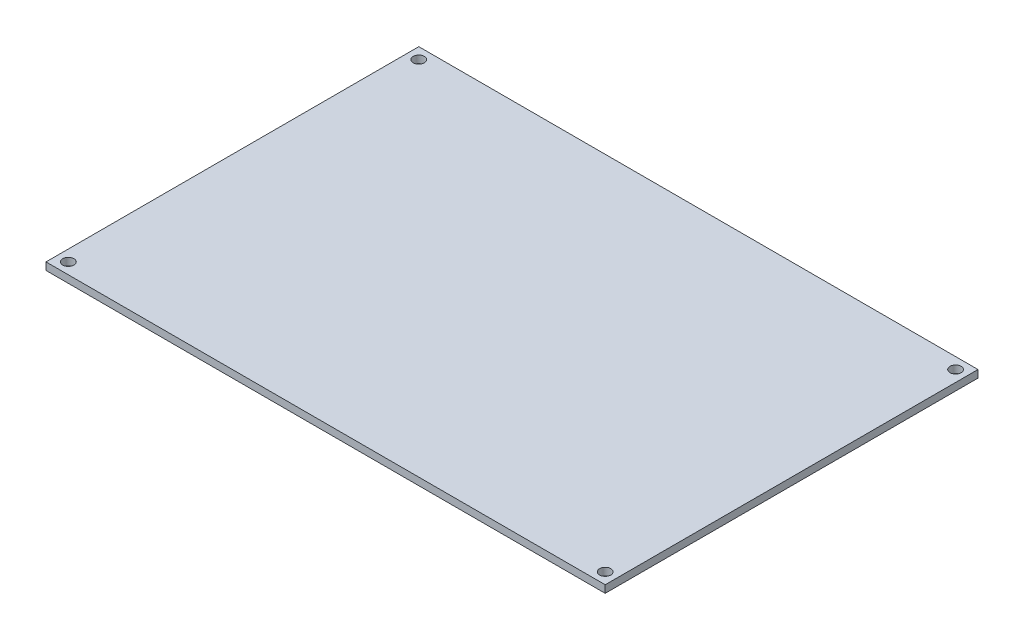
ISO-10303-21;
HEADER;
FILE_DESCRIPTION(('STEP AP214'),'2;1');
FILE_NAME('part.step','',(''),(''),'','','');
FILE_SCHEMA(('AUTOMOTIVE_DESIGN { 1 0 10303 214 1 1 1 1 }'));
ENDSEC;
DATA;
#1=APPLICATION_CONTEXT('core data for automotive mechanical design processes');
#2=APPLICATION_PROTOCOL_DEFINITION('international standard','automotive_design',2000,#1);
#3=PRODUCT_CONTEXT('',#1,'mechanical');
#4=PRODUCT('Part','Part','',(#3));
#5=PRODUCT_RELATED_PRODUCT_CATEGORY('part','',(#4));
#6=PRODUCT_DEFINITION_FORMATION('','',#4);
#7=PRODUCT_DEFINITION_CONTEXT('part definition',#1,'design');
#8=PRODUCT_DEFINITION('design','',#6,#7);
#9=PRODUCT_DEFINITION_SHAPE('','',#8);
#10=(LENGTH_UNIT() NAMED_UNIT(*) SI_UNIT(.MILLI.,.METRE.));
#11=(NAMED_UNIT(*) PLANE_ANGLE_UNIT() SI_UNIT($,.RADIAN.));
#12=(NAMED_UNIT(*) SI_UNIT($,.STERADIAN.) SOLID_ANGLE_UNIT());
#13=UNCERTAINTY_MEASURE_WITH_UNIT(LENGTH_MEASURE(1.E-05),#10,'distance_accuracy_value','');
#14=(GEOMETRIC_REPRESENTATION_CONTEXT(3) GLOBAL_UNCERTAINTY_ASSIGNED_CONTEXT((#13)) GLOBAL_UNIT_ASSIGNED_CONTEXT((#10,
#11,#12)) REPRESENTATION_CONTEXT('',''));
#15=CARTESIAN_POINT('',(0.,0.,0.));
#16=DIRECTION('',(0.,0.,1.));
#17=DIRECTION('',(1.,0.,0.));
#18=AXIS2_PLACEMENT_3D('',#15,#16,#17);
#19=CARTESIAN_POINT('',(75.,2.,-50.));
#20=DIRECTION('',(-1.,0.,0.));
#21=DIRECTION('',(0.,0.,1.));
#22=AXIS2_PLACEMENT_3D('',#19,#20,#21);
#23=PLANE('',#22);
#24=DIRECTION('',(0.,0.,-1.));
#25=VECTOR('',#24,1.);
#26=CARTESIAN_POINT('',(75.,0.,-50.));
#27=LINE('',#26,#25);
#28=CARTESIAN_POINT('',(75.,0.,50.));
#29=VERTEX_POINT('',#28);
#30=CARTESIAN_POINT('',(75.,0.,-50.));
#31=VERTEX_POINT('',#30);
#32=EDGE_CURVE('E107',#29,#31,#27,.T.);
#33=ORIENTED_EDGE('',*,*,#32,.T.);
#34=DIRECTION('',(0.,-1.,0.));
#35=VECTOR('',#34,1.);
#36=CARTESIAN_POINT('',(75.,2.,-50.));
#37=LINE('',#36,#35);
#38=CARTESIAN_POINT('',(75.,2.,-50.));
#39=VERTEX_POINT('',#38);
#40=EDGE_CURVE('E11',#39,#31,#37,.T.);
#41=ORIENTED_EDGE('',*,*,#40,.F.);
#42=DIRECTION('',(0.,0.,-1.));
#43=VECTOR('',#42,1.);
#44=CARTESIAN_POINT('',(75.,2.,-50.));
#45=LINE('',#44,#43);
#46=CARTESIAN_POINT('',(75.,2.,50.));
#47=VERTEX_POINT('',#46);
#48=EDGE_CURVE('E91',#47,#39,#45,.T.);
#49=ORIENTED_EDGE('',*,*,#48,.F.);
#50=DIRECTION('',(0.,-1.,0.));
#51=VECTOR('',#50,1.);
#52=CARTESIAN_POINT('',(75.,2.,50.));
#53=LINE('',#52,#51);
#54=EDGE_CURVE('E103',#47,#29,#53,.T.);
#55=ORIENTED_EDGE('',*,*,#54,.T.);
#56=EDGE_LOOP('',(#33,#41,#49,#55));
#57=FACE_BOUND('',#56,.T.);
#58=ADVANCED_FACE('F39',(#57),#23,.F.);
#59=CARTESIAN_POINT('',(-75.,2.,-50.));
#60=DIRECTION('',(0.,0.,1.));
#61=DIRECTION('',(1.,0.,0.));
#62=AXIS2_PLACEMENT_3D('',#59,#60,#61);
#63=PLANE('',#62);
#64=DIRECTION('',(-1.,0.,0.));
#65=VECTOR('',#64,1.);
#66=CARTESIAN_POINT('',(-75.,0.,-50.));
#67=LINE('',#66,#65);
#68=CARTESIAN_POINT('',(-75.,0.,-50.));
#69=VERTEX_POINT('',#68);
#70=EDGE_CURVE('E96',#31,#69,#67,.T.);
#71=ORIENTED_EDGE('',*,*,#70,.T.);
#72=DIRECTION('',(0.,-1.,0.));
#73=VECTOR('',#72,1.);
#74=CARTESIAN_POINT('',(-75.,2.,-50.));
#75=LINE('',#74,#73);
#76=CARTESIAN_POINT('',(-75.,2.,-50.));
#77=VERTEX_POINT('',#76);
#78=EDGE_CURVE('E48',#77,#69,#75,.T.);
#79=ORIENTED_EDGE('',*,*,#78,.F.);
#80=DIRECTION('',(-1.,0.,0.));
#81=VECTOR('',#80,1.);
#82=CARTESIAN_POINT('',(-75.,2.,-50.));
#83=LINE('',#82,#81);
#84=EDGE_CURVE('E86',#39,#77,#83,.T.);
#85=ORIENTED_EDGE('',*,*,#84,.F.);
#86=ORIENTED_EDGE('',*,*,#40,.T.);
#87=EDGE_LOOP('',(#71,#79,#85,#86));
#88=FACE_BOUND('',#87,.T.);
#89=ADVANCED_FACE('F95',(#88),#63,.F.);
#90=CARTESIAN_POINT('',(-75.,2.,-50.));
#91=DIRECTION('',(1.,0.,0.));
#92=DIRECTION('',(0.,0.,-1.));
#93=AXIS2_PLACEMENT_3D('',#90,#91,#92);
#94=PLANE('',#93);
#95=DIRECTION('',(0.,0.,1.));
#96=VECTOR('',#95,1.);
#97=CARTESIAN_POINT('',(-75.,0.,-50.));
#98=LINE('',#97,#96);
#99=CARTESIAN_POINT('',(-75.,0.,50.));
#100=VERTEX_POINT('',#99);
#101=EDGE_CURVE('E73',#69,#100,#98,.T.);
#102=ORIENTED_EDGE('',*,*,#101,.T.);
#103=DIRECTION('',(0.,-1.,0.));
#104=VECTOR('',#103,1.);
#105=CARTESIAN_POINT('',(-75.,2.,50.));
#106=LINE('',#105,#104);
#107=CARTESIAN_POINT('',(-75.,2.,50.));
#108=VERTEX_POINT('',#107);
#109=EDGE_CURVE('E98',#108,#100,#106,.T.);
#110=ORIENTED_EDGE('',*,*,#109,.F.);
#111=DIRECTION('',(0.,0.,1.));
#112=VECTOR('',#111,1.);
#113=CARTESIAN_POINT('',(-75.,2.,-50.));
#114=LINE('',#113,#112);
#115=EDGE_CURVE('E89',#77,#108,#114,.T.);
#116=ORIENTED_EDGE('',*,*,#115,.F.);
#117=ORIENTED_EDGE('',*,*,#78,.T.);
#118=EDGE_LOOP('',(#102,#110,#116,#117));
#119=FACE_BOUND('',#118,.T.);
#120=ADVANCED_FACE('F99',(#119),#94,.F.);
#121=CARTESIAN_POINT('',(-75.,2.,50.));
#122=DIRECTION('',(0.,0.,-1.));
#123=DIRECTION('',(-1.,0.,0.));
#124=AXIS2_PLACEMENT_3D('',#121,#122,#123);
#125=PLANE('',#124);
#126=DIRECTION('',(1.,0.,0.));
#127=VECTOR('',#126,1.);
#128=CARTESIAN_POINT('',(-75.,0.,50.));
#129=LINE('',#128,#127);
#130=EDGE_CURVE('E79',#100,#29,#129,.T.);
#131=ORIENTED_EDGE('',*,*,#130,.T.);
#132=ORIENTED_EDGE('',*,*,#54,.F.);
#133=DIRECTION('',(1.,0.,0.));
#134=VECTOR('',#133,1.);
#135=CARTESIAN_POINT('',(-75.,2.,50.));
#136=LINE('',#135,#134);
#137=EDGE_CURVE('E56',#108,#47,#136,.T.);
#138=ORIENTED_EDGE('',*,*,#137,.F.);
#139=ORIENTED_EDGE('',*,*,#109,.T.);
#140=EDGE_LOOP('',(#131,#132,#138,#139));
#141=FACE_BOUND('',#140,.T.);
#142=ADVANCED_FACE('F121',(#141),#125,.F.);
#143=CARTESIAN_POINT('',(0.,2.,0.));
#144=DIRECTION('',(0.,1.,0.));
#145=DIRECTION('',(0.,0.,1.));
#146=AXIS2_PLACEMENT_3D('',#143,#144,#145);
#147=PLANE('',#146);
#148=CARTESIAN_POINT('',(72.,2.,-47.));
#149=DIRECTION('',(0.,1.,0.));
#150=DIRECTION('',(0.,0.,1.));
#151=AXIS2_PLACEMENT_3D('',#148,#149,#150);
#152=CIRCLE('',#151,1.5);
#153=CARTESIAN_POINT('',(72.,2.,-45.5));
#154=VERTEX_POINT('',#153);
#155=EDGE_CURVE('E136',#154,#154,#152,.T.);
#156=ORIENTED_EDGE('',*,*,#155,.F.);
#157=EDGE_LOOP('',(#156));
#158=FACE_BOUND('',#157,.T.);
#159=CARTESIAN_POINT('',(72.,2.,47.));
#160=DIRECTION('',(0.,1.,0.));
#161=DIRECTION('',(0.,0.,1.));
#162=AXIS2_PLACEMENT_3D('',#159,#160,#161);
#163=CIRCLE('',#162,1.5);
#164=CARTESIAN_POINT('',(72.,2.,48.5));
#165=VERTEX_POINT('',#164);
#166=EDGE_CURVE('E144',#165,#165,#163,.T.);
#167=ORIENTED_EDGE('',*,*,#166,.F.);
#168=EDGE_LOOP('',(#167));
#169=FACE_BOUND('',#168,.T.);
#170=CARTESIAN_POINT('',(-72.,2.,47.));
#171=DIRECTION('',(0.,1.,0.));
#172=DIRECTION('',(0.,0.,1.));
#173=AXIS2_PLACEMENT_3D('',#170,#171,#172);
#174=CIRCLE('',#173,1.5);
#175=CARTESIAN_POINT('',(-72.,2.,48.5));
#176=VERTEX_POINT('',#175);
#177=EDGE_CURVE('E152',#176,#176,#174,.T.);
#178=ORIENTED_EDGE('',*,*,#177,.F.);
#179=EDGE_LOOP('',(#178));
#180=FACE_BOUND('',#179,.T.);
#181=CARTESIAN_POINT('',(-72.,2.,-47.));
#182=DIRECTION('',(0.,1.,0.));
#183=DIRECTION('',(0.,0.,1.));
#184=AXIS2_PLACEMENT_3D('',#181,#182,#183);
#185=CIRCLE('',#184,1.5);
#186=CARTESIAN_POINT('',(-72.,2.,-45.5));
#187=VERTEX_POINT('',#186);
#188=EDGE_CURVE('E128',#187,#187,#185,.T.);
#189=ORIENTED_EDGE('',*,*,#188,.F.);
#190=EDGE_LOOP('',(#189));
#191=FACE_BOUND('',#190,.T.);
#192=ORIENTED_EDGE('',*,*,#48,.T.);
#193=ORIENTED_EDGE('',*,*,#84,.T.);
#194=ORIENTED_EDGE('',*,*,#115,.T.);
#195=ORIENTED_EDGE('',*,*,#137,.T.);
#196=EDGE_LOOP('',(#192,#193,#194,#195));
#197=FACE_BOUND('',#196,.T.);
#198=ADVANCED_FACE('F87',(#158,#169,#180,#191,#197),#147,.T.);
#199=CARTESIAN_POINT('',(0.,0.,0.));
#200=DIRECTION('',(0.,1.,0.));
#201=DIRECTION('',(0.,0.,1.));
#202=AXIS2_PLACEMENT_3D('',#199,#200,#201);
#203=PLANE('',#202);
#204=CARTESIAN_POINT('',(72.,0.,-47.));
#205=DIRECTION('',(0.,1.,0.));
#206=DIRECTION('',(0.,0.,1.));
#207=AXIS2_PLACEMENT_3D('',#204,#205,#206);
#208=CIRCLE('',#207,1.5);
#209=CARTESIAN_POINT('',(72.,0.,-45.5));
#210=VERTEX_POINT('',#209);
#211=EDGE_CURVE('E140',#210,#210,#208,.T.);
#212=ORIENTED_EDGE('',*,*,#211,.T.);
#213=EDGE_LOOP('',(#212));
#214=FACE_BOUND('',#213,.T.);
#215=CARTESIAN_POINT('',(72.,0.,47.));
#216=DIRECTION('',(0.,1.,0.));
#217=DIRECTION('',(0.,0.,1.));
#218=AXIS2_PLACEMENT_3D('',#215,#216,#217);
#219=CIRCLE('',#218,1.5);
#220=CARTESIAN_POINT('',(72.,0.,48.5));
#221=VERTEX_POINT('',#220);
#222=EDGE_CURVE('E148',#221,#221,#219,.T.);
#223=ORIENTED_EDGE('',*,*,#222,.T.);
#224=EDGE_LOOP('',(#223));
#225=FACE_BOUND('',#224,.T.);
#226=CARTESIAN_POINT('',(-72.,0.,47.));
#227=DIRECTION('',(0.,1.,0.));
#228=DIRECTION('',(0.,0.,1.));
#229=AXIS2_PLACEMENT_3D('',#226,#227,#228);
#230=CIRCLE('',#229,1.5);
#231=CARTESIAN_POINT('',(-72.,0.,48.5));
#232=VERTEX_POINT('',#231);
#233=EDGE_CURVE('E132',#232,#232,#230,.T.);
#234=ORIENTED_EDGE('',*,*,#233,.T.);
#235=EDGE_LOOP('',(#234));
#236=FACE_BOUND('',#235,.T.);
#237=CARTESIAN_POINT('',(-72.,0.,-47.));
#238=DIRECTION('',(0.,1.,0.));
#239=DIRECTION('',(0.,0.,1.));
#240=AXIS2_PLACEMENT_3D('',#237,#238,#239);
#241=CIRCLE('',#240,1.5);
#242=CARTESIAN_POINT('',(-72.,0.,-45.5));
#243=VERTEX_POINT('',#242);
#244=EDGE_CURVE('E111',#243,#243,#241,.T.);
#245=ORIENTED_EDGE('',*,*,#244,.T.);
#246=EDGE_LOOP('',(#245));
#247=FACE_BOUND('',#246,.T.);
#248=ORIENTED_EDGE('',*,*,#32,.F.);
#249=ORIENTED_EDGE('',*,*,#130,.F.);
#250=ORIENTED_EDGE('',*,*,#101,.F.);
#251=ORIENTED_EDGE('',*,*,#70,.F.);
#252=EDGE_LOOP('',(#248,#249,#250,#251));
#253=FACE_BOUND('',#252,.T.);
#254=ADVANCED_FACE('F124',(#214,#225,#236,#247,#253),#203,.F.);
#255=CARTESIAN_POINT('',(-72.,0.,-47.));
#256=DIRECTION('',(0.,1.,0.));
#257=DIRECTION('',(0.,0.,1.));
#258=AXIS2_PLACEMENT_3D('',#255,#256,#257);
#259=CYLINDRICAL_SURFACE('',#258,1.5);
#260=ORIENTED_EDGE('',*,*,#244,.F.);
#261=EDGE_LOOP('',(#260));
#262=FACE_BOUND('',#261,.T.);
#263=ORIENTED_EDGE('',*,*,#188,.T.);
#264=EDGE_LOOP('',(#263));
#265=FACE_BOUND('',#264,.T.);
#266=ADVANCED_FACE('F166',(#262,#265),#259,.F.);
#267=CARTESIAN_POINT('',(-72.,0.,47.));
#268=DIRECTION('',(0.,1.,0.));
#269=DIRECTION('',(0.,0.,1.));
#270=AXIS2_PLACEMENT_3D('',#267,#268,#269);
#271=CYLINDRICAL_SURFACE('',#270,1.5);
#272=ORIENTED_EDGE('',*,*,#233,.F.);
#273=EDGE_LOOP('',(#272));
#274=FACE_BOUND('',#273,.T.);
#275=ORIENTED_EDGE('',*,*,#177,.T.);
#276=EDGE_LOOP('',(#275));
#277=FACE_BOUND('',#276,.T.);
#278=ADVANCED_FACE('F162',(#274,#277),#271,.F.);
#279=CARTESIAN_POINT('',(72.,0.,47.));
#280=DIRECTION('',(0.,1.,0.));
#281=DIRECTION('',(0.,0.,1.));
#282=AXIS2_PLACEMENT_3D('',#279,#280,#281);
#283=CYLINDRICAL_SURFACE('',#282,1.5);
#284=ORIENTED_EDGE('',*,*,#222,.F.);
#285=EDGE_LOOP('',(#284));
#286=FACE_BOUND('',#285,.T.);
#287=ORIENTED_EDGE('',*,*,#166,.T.);
#288=EDGE_LOOP('',(#287));
#289=FACE_BOUND('',#288,.T.);
#290=ADVANCED_FACE('F165',(#286,#289),#283,.F.);
#291=CARTESIAN_POINT('',(72.,0.,-47.));
#292=DIRECTION('',(0.,1.,0.));
#293=DIRECTION('',(0.,0.,1.));
#294=AXIS2_PLACEMENT_3D('',#291,#292,#293);
#295=CYLINDRICAL_SURFACE('',#294,1.5);
#296=ORIENTED_EDGE('',*,*,#211,.F.);
#297=EDGE_LOOP('',(#296));
#298=FACE_BOUND('',#297,.T.);
#299=ORIENTED_EDGE('',*,*,#155,.T.);
#300=EDGE_LOOP('',(#299));
#301=FACE_BOUND('',#300,.T.);
#302=ADVANCED_FACE('F227',(#298,#301),#295,.F.);
#303=CLOSED_SHELL('',(#58,#89,#120,#142,#198,#254,#266,#278,#290,#302));
#304=MANIFOLD_SOLID_BREP('B2',#303);
#305=ADVANCED_BREP_SHAPE_REPRESENTATION('',(#18,#304),#14);
#306=SHAPE_DEFINITION_REPRESENTATION(#9,#305);
ENDSEC;
END-ISO-10303-21;
